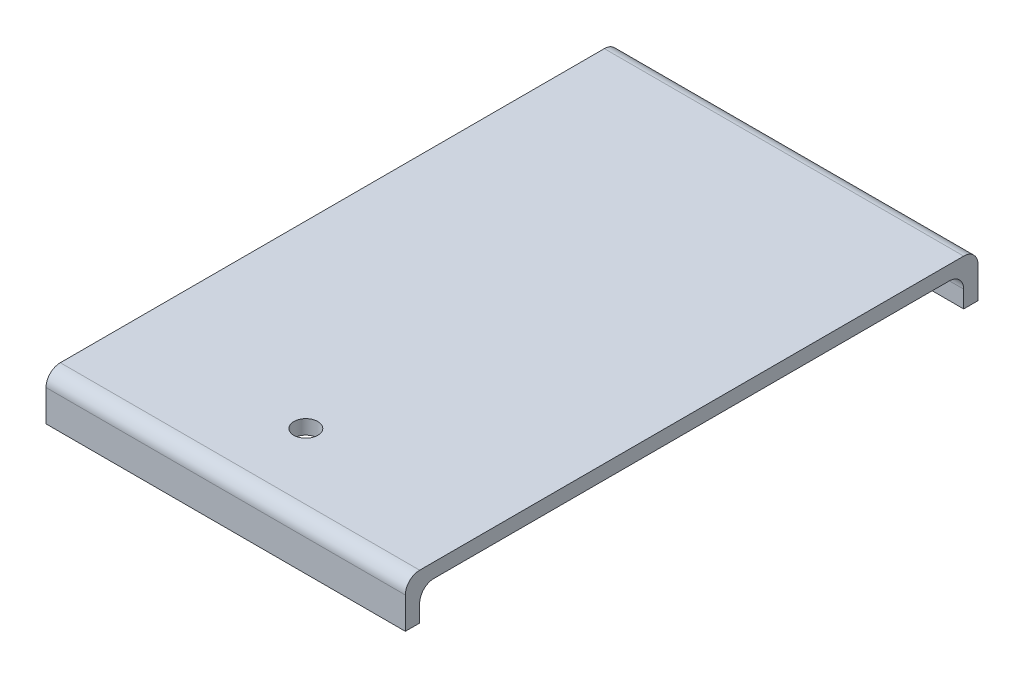
ISO-10303-21;
HEADER;
FILE_DESCRIPTION(('STEP AP214'),'2;1');
FILE_NAME('part.step','',(''),(''),'','','');
FILE_SCHEMA(('AUTOMOTIVE_DESIGN { 1 0 10303 214 1 1 1 1 }'));
ENDSEC;
DATA;
#1=APPLICATION_CONTEXT('core data for automotive mechanical design processes');
#2=APPLICATION_PROTOCOL_DEFINITION('international standard','automotive_design',2000,#1);
#3=PRODUCT_CONTEXT('',#1,'mechanical');
#4=PRODUCT('Part','Part','',(#3));
#5=PRODUCT_RELATED_PRODUCT_CATEGORY('part','',(#4));
#6=PRODUCT_DEFINITION_FORMATION('','',#4);
#7=PRODUCT_DEFINITION_CONTEXT('part definition',#1,'design');
#8=PRODUCT_DEFINITION('design','',#6,#7);
#9=PRODUCT_DEFINITION_SHAPE('','',#8);
#10=(LENGTH_UNIT() NAMED_UNIT(*) SI_UNIT(.MILLI.,.METRE.));
#11=(NAMED_UNIT(*) PLANE_ANGLE_UNIT() SI_UNIT($,.RADIAN.));
#12=(NAMED_UNIT(*) SI_UNIT($,.STERADIAN.) SOLID_ANGLE_UNIT());
#13=UNCERTAINTY_MEASURE_WITH_UNIT(LENGTH_MEASURE(1.E-05),#10,'distance_accuracy_value','');
#14=(GEOMETRIC_REPRESENTATION_CONTEXT(3) GLOBAL_UNCERTAINTY_ASSIGNED_CONTEXT((#13)) GLOBAL_UNIT_ASSIGNED_CONTEXT((#10,
#11,#12)) REPRESENTATION_CONTEXT('',''));
#15=CARTESIAN_POINT('',(0.,0.,0.));
#16=DIRECTION('',(0.,0.,1.));
#17=DIRECTION('',(1.,0.,0.));
#18=AXIS2_PLACEMENT_3D('',#15,#16,#17);
#19=CARTESIAN_POINT('',(0.,15.9999999999999,100.));
#20=DIRECTION('',(0.,0.,1.));
#21=DIRECTION('',(1.,0.,0.));
#22=AXIS2_PLACEMENT_3D('',#19,#20,#21);
#23=PLANE('',#22);
#24=DIRECTION('',(1.,0.,0.));
#25=VECTOR('',#24,1.);
#26=CARTESIAN_POINT('',(0.,0.,100.));
#27=LINE('',#26,#25);
#28=CARTESIAN_POINT('',(125.5,0.,100.));
#29=VERTEX_POINT('',#28);
#30=CARTESIAN_POINT('',(0.,0.,100.));
#31=VERTEX_POINT('',#30);
#32=EDGE_CURVE('E112',#29,#31,#27,.F.);
#33=ORIENTED_EDGE('',*,*,#32,.F.);
#34=DIRECTION('',(0.,1.,0.));
#35=VECTOR('',#34,1.);
#36=CARTESIAN_POINT('',(125.5,7.99999999999998,100.));
#37=LINE('',#36,#35);
#38=CARTESIAN_POINT('',(125.5,10.9999999999999,100.));
#39=VERTEX_POINT('',#38);
#40=EDGE_CURVE('E124',#39,#29,#37,.F.);
#41=ORIENTED_EDGE('',*,*,#40,.F.);
#42=DIRECTION('',(1.,0.,0.));
#43=VECTOR('',#42,1.);
#44=CARTESIAN_POINT('',(0.,10.9999999999999,100.));
#45=LINE('',#44,#43);
#46=CARTESIAN_POINT('',(0.,10.9999999999999,100.));
#47=VERTEX_POINT('',#46);
#48=EDGE_CURVE('E135',#47,#39,#45,.T.);
#49=ORIENTED_EDGE('',*,*,#48,.F.);
#50=DIRECTION('',(0.,1.,0.));
#51=VECTOR('',#50,1.);
#52=CARTESIAN_POINT('',(0.,7.99999999999998,100.));
#53=LINE('',#52,#51);
#54=EDGE_CURVE('E142',#47,#31,#53,.F.);
#55=ORIENTED_EDGE('',*,*,#54,.T.);
#56=EDGE_LOOP('',(#33,#41,#49,#55));
#57=FACE_BOUND('',#56,.T.);
#58=ADVANCED_FACE('F17',(#57),#23,.T.);
#59=CARTESIAN_POINT('',(0.,0.,100.));
#60=DIRECTION('',(0.,-1.,0.));
#61=DIRECTION('',(0.,0.,-1.));
#62=AXIS2_PLACEMENT_3D('',#59,#60,#61);
#63=PLANE('',#62);
#64=ORIENTED_EDGE('',*,*,#32,.T.);
#65=DIRECTION('',(0.,0.,-1.));
#66=VECTOR('',#65,1.);
#67=CARTESIAN_POINT('',(0.,0.,0.));
#68=LINE('',#67,#66);
#69=CARTESIAN_POINT('',(0.,0.,95.));
#70=VERTEX_POINT('',#69);
#71=EDGE_CURVE('E86',#31,#70,#68,.T.);
#72=ORIENTED_EDGE('',*,*,#71,.T.);
#73=DIRECTION('',(1.,0.,0.));
#74=VECTOR('',#73,1.);
#75=CARTESIAN_POINT('',(0.,0.,95.));
#76=LINE('',#75,#74);
#77=CARTESIAN_POINT('',(125.5,0.,95.));
#78=VERTEX_POINT('',#77);
#79=EDGE_CURVE('E107',#70,#78,#76,.T.);
#80=ORIENTED_EDGE('',*,*,#79,.T.);
#81=DIRECTION('',(0.,0.,-1.));
#82=VECTOR('',#81,1.);
#83=CARTESIAN_POINT('',(125.5,0.,0.));
#84=LINE('',#83,#82);
#85=EDGE_CURVE('E110',#29,#78,#84,.T.);
#86=ORIENTED_EDGE('',*,*,#85,.F.);
#87=EDGE_LOOP('',(#64,#72,#80,#86));
#88=FACE_BOUND('',#87,.T.);
#89=ADVANCED_FACE('F108',(#88),#63,.T.);
#90=CARTESIAN_POINT('',(0.,11.,95.));
#91=DIRECTION('',(0.,0.,1.));
#92=DIRECTION('',(1.,0.,0.));
#93=AXIS2_PLACEMENT_3D('',#90,#91,#92);
#94=PLANE('',#93);
#95=DIRECTION('',(0.,1.,0.));
#96=VECTOR('',#95,1.);
#97=CARTESIAN_POINT('',(125.5,7.99999999999998,95.));
#98=LINE('',#97,#96);
#99=CARTESIAN_POINT('',(125.5,5.99999999999999,95.));
#100=VERTEX_POINT('',#99);
#101=EDGE_CURVE('E115',#78,#100,#98,.T.);
#102=ORIENTED_EDGE('',*,*,#101,.F.);
#103=ORIENTED_EDGE('',*,*,#79,.F.);
#104=DIRECTION('',(0.,1.,0.));
#105=VECTOR('',#104,1.);
#106=CARTESIAN_POINT('',(0.,7.99999999999998,95.));
#107=LINE('',#106,#105);
#108=CARTESIAN_POINT('',(0.,5.99999999999999,95.));
#109=VERTEX_POINT('',#108);
#110=EDGE_CURVE('E76',#70,#109,#107,.T.);
#111=ORIENTED_EDGE('',*,*,#110,.T.);
#112=DIRECTION('',(1.,0.,0.));
#113=VECTOR('',#112,1.);
#114=CARTESIAN_POINT('',(0.,5.99999999999999,95.));
#115=LINE('',#114,#113);
#116=EDGE_CURVE('E103',#109,#100,#115,.T.);
#117=ORIENTED_EDGE('',*,*,#116,.T.);
#118=EDGE_LOOP('',(#102,#103,#111,#117));
#119=FACE_BOUND('',#118,.T.);
#120=ADVANCED_FACE('F116',(#119),#94,.F.);
#121=CARTESIAN_POINT('',(0.,5.99999999999999,90.));
#122=DIRECTION('',(1.,0.,0.));
#123=DIRECTION('',(0.,0.,-1.));
#124=AXIS2_PLACEMENT_3D('',#121,#122,#123);
#125=CYLINDRICAL_SURFACE('',#124,5.);
#126=DIRECTION('',(1.,0.,0.));
#127=VECTOR('',#126,1.);
#128=CARTESIAN_POINT('',(0.,11.,90.));
#129=LINE('',#128,#127);
#130=CARTESIAN_POINT('',(0.,11.,90.));
#131=VERTEX_POINT('',#130);
#132=CARTESIAN_POINT('',(125.5,11.,90.));
#133=VERTEX_POINT('',#132);
#134=EDGE_CURVE('E143',#131,#133,#129,.T.);
#135=ORIENTED_EDGE('',*,*,#134,.T.);
#136=CARTESIAN_POINT('',(125.5,5.99999999999999,90.));
#137=DIRECTION('',(1.,0.,0.));
#138=DIRECTION('',(0.,0.,-1.));
#139=AXIS2_PLACEMENT_3D('',#136,#137,#138);
#140=CIRCLE('',#139,5.);
#141=EDGE_CURVE('E119',#100,#133,#140,.F.);
#142=ORIENTED_EDGE('',*,*,#141,.F.);
#143=ORIENTED_EDGE('',*,*,#116,.F.);
#144=CARTESIAN_POINT('',(0.,5.99999999999999,90.));
#145=DIRECTION('',(1.,0.,0.));
#146=DIRECTION('',(0.,0.,-1.));
#147=AXIS2_PLACEMENT_3D('',#144,#145,#146);
#148=CIRCLE('',#147,5.);
#149=EDGE_CURVE('E20',#109,#131,#148,.F.);
#150=ORIENTED_EDGE('',*,*,#149,.T.);
#151=EDGE_LOOP('',(#135,#142,#143,#150));
#152=FACE_BOUND('',#151,.T.);
#153=ADVANCED_FACE('F218',(#152),#125,.F.);
#154=CARTESIAN_POINT('',(0.,6.00000000000001,-90.));
#155=DIRECTION('',(1.,0.,0.));
#156=DIRECTION('',(0.,0.,-1.));
#157=AXIS2_PLACEMENT_3D('',#154,#155,#156);
#158=CYLINDRICAL_SURFACE('',#157,5.);
#159=DIRECTION('',(-1.,0.,0.));
#160=VECTOR('',#159,1.);
#161=CARTESIAN_POINT('',(0.,6.00000000000001,-95.));
#162=LINE('',#161,#160);
#163=CARTESIAN_POINT('',(0.,6.00000000000001,-95.));
#164=VERTEX_POINT('',#163);
#165=CARTESIAN_POINT('',(125.5,6.00000000000001,-95.));
#166=VERTEX_POINT('',#165);
#167=EDGE_CURVE('E205',#164,#166,#162,.F.);
#168=ORIENTED_EDGE('',*,*,#167,.T.);
#169=CARTESIAN_POINT('',(125.5,6.00000000000001,-90.));
#170=DIRECTION('',(1.,0.,0.));
#171=DIRECTION('',(0.,0.,-1.));
#172=AXIS2_PLACEMENT_3D('',#169,#170,#171);
#173=CIRCLE('',#172,5.);
#174=CARTESIAN_POINT('',(125.5,11.,-90.));
#175=VERTEX_POINT('',#174);
#176=EDGE_CURVE('E159',#175,#166,#173,.F.);
#177=ORIENTED_EDGE('',*,*,#176,.F.);
#178=DIRECTION('',(1.,0.,0.));
#179=VECTOR('',#178,1.);
#180=CARTESIAN_POINT('',(0.,11.,-90.));
#181=LINE('',#180,#179);
#182=CARTESIAN_POINT('',(0.,11.,-90.));
#183=VERTEX_POINT('',#182);
#184=EDGE_CURVE('E195',#175,#183,#181,.F.);
#185=ORIENTED_EDGE('',*,*,#184,.T.);
#186=CARTESIAN_POINT('',(0.,6.00000000000001,-90.));
#187=DIRECTION('',(1.,0.,0.));
#188=DIRECTION('',(0.,0.,-1.));
#189=AXIS2_PLACEMENT_3D('',#186,#187,#188);
#190=CIRCLE('',#189,5.);
#191=EDGE_CURVE('E171',#183,#164,#190,.F.);
#192=ORIENTED_EDGE('',*,*,#191,.T.);
#193=EDGE_LOOP('',(#168,#177,#185,#192));
#194=FACE_BOUND('',#193,.T.);
#195=ADVANCED_FACE('F212',(#194),#158,.F.);
#196=CARTESIAN_POINT('',(0.,0.,-95.));
#197=DIRECTION('',(0.,0.,-1.));
#198=DIRECTION('',(-1.,0.,0.));
#199=AXIS2_PLACEMENT_3D('',#196,#197,#198);
#200=PLANE('',#199);
#201=DIRECTION('',(0.,1.,0.));
#202=VECTOR('',#201,1.);
#203=CARTESIAN_POINT('',(0.,7.99999999999998,-95.));
#204=LINE('',#203,#202);
#205=CARTESIAN_POINT('',(0.,0.,-95.));
#206=VERTEX_POINT('',#205);
#207=EDGE_CURVE('E148',#164,#206,#204,.F.);
#208=ORIENTED_EDGE('',*,*,#207,.T.);
#209=DIRECTION('',(1.,0.,0.));
#210=VECTOR('',#209,1.);
#211=CARTESIAN_POINT('',(0.,0.,-95.));
#212=LINE('',#211,#210);
#213=CARTESIAN_POINT('',(125.5,0.,-95.));
#214=VERTEX_POINT('',#213);
#215=EDGE_CURVE('E196',#214,#206,#212,.F.);
#216=ORIENTED_EDGE('',*,*,#215,.F.);
#217=DIRECTION('',(0.,1.,0.));
#218=VECTOR('',#217,1.);
#219=CARTESIAN_POINT('',(125.5,7.99999999999998,-95.));
#220=LINE('',#219,#218);
#221=EDGE_CURVE('E162',#166,#214,#220,.F.);
#222=ORIENTED_EDGE('',*,*,#221,.F.);
#223=ORIENTED_EDGE('',*,*,#167,.F.);
#224=EDGE_LOOP('',(#208,#216,#222,#223));
#225=FACE_BOUND('',#224,.T.);
#226=ADVANCED_FACE('F227',(#225),#200,.F.);
#227=CARTESIAN_POINT('',(0.,0.,100.));
#228=DIRECTION('',(0.,-1.,0.));
#229=DIRECTION('',(0.,0.,-1.));
#230=AXIS2_PLACEMENT_3D('',#227,#228,#229);
#231=PLANE('',#230);
#232=DIRECTION('',(-1.,0.,0.));
#233=VECTOR('',#232,1.);
#234=CARTESIAN_POINT('',(0.,0.,-100.));
#235=LINE('',#234,#233);
#236=CARTESIAN_POINT('',(125.5,0.,-100.));
#237=VERTEX_POINT('',#236);
#238=CARTESIAN_POINT('',(0.,0.,-100.));
#239=VERTEX_POINT('',#238);
#240=EDGE_CURVE('E192',#237,#239,#235,.T.);
#241=ORIENTED_EDGE('',*,*,#240,.F.);
#242=DIRECTION('',(0.,0.,-1.));
#243=VECTOR('',#242,1.);
#244=CARTESIAN_POINT('',(125.5,0.,0.));
#245=LINE('',#244,#243);
#246=EDGE_CURVE('E199',#214,#237,#245,.T.);
#247=ORIENTED_EDGE('',*,*,#246,.F.);
#248=ORIENTED_EDGE('',*,*,#215,.T.);
#249=DIRECTION('',(0.,0.,-1.));
#250=VECTOR('',#249,1.);
#251=CARTESIAN_POINT('',(0.,0.,0.));
#252=LINE('',#251,#250);
#253=EDGE_CURVE('E144',#206,#239,#252,.T.);
#254=ORIENTED_EDGE('',*,*,#253,.T.);
#255=EDGE_LOOP('',(#241,#247,#248,#254));
#256=FACE_BOUND('',#255,.T.);
#257=ADVANCED_FACE('F233',(#256),#231,.T.);
#258=CARTESIAN_POINT('',(0.,0.,-100.));
#259=DIRECTION('',(0.,0.,-1.));
#260=DIRECTION('',(-1.,0.,0.));
#261=AXIS2_PLACEMENT_3D('',#258,#259,#260);
#262=PLANE('',#261);
#263=ORIENTED_EDGE('',*,*,#240,.T.);
#264=DIRECTION('',(0.,1.,0.));
#265=VECTOR('',#264,1.);
#266=CARTESIAN_POINT('',(0.,7.99999999999998,-100.));
#267=LINE('',#266,#265);
#268=CARTESIAN_POINT('',(0.,11.,-100.));
#269=VERTEX_POINT('',#268);
#270=EDGE_CURVE('E147',#239,#269,#267,.T.);
#271=ORIENTED_EDGE('',*,*,#270,.T.);
#272=DIRECTION('',(1.,0.,0.));
#273=VECTOR('',#272,1.);
#274=CARTESIAN_POINT('',(0.,11.,-100.));
#275=LINE('',#274,#273);
#276=CARTESIAN_POINT('',(125.5,11.,-100.));
#277=VERTEX_POINT('',#276);
#278=EDGE_CURVE('E139',#277,#269,#275,.F.);
#279=ORIENTED_EDGE('',*,*,#278,.F.);
#280=DIRECTION('',(0.,1.,0.));
#281=VECTOR('',#280,1.);
#282=CARTESIAN_POINT('',(125.5,7.99999999999998,-100.));
#283=LINE('',#282,#281);
#284=EDGE_CURVE('E158',#237,#277,#283,.T.);
#285=ORIENTED_EDGE('',*,*,#284,.F.);
#286=EDGE_LOOP('',(#263,#271,#279,#285));
#287=FACE_BOUND('',#286,.T.);
#288=ADVANCED_FACE('F261',(#287),#262,.T.);
#289=CARTESIAN_POINT('',(0.,11.,-95.));
#290=DIRECTION('',(0.,1.,0.));
#291=DIRECTION('',(0.,0.,1.));
#292=AXIS2_PLACEMENT_3D('',#289,#290,#291);
#293=PLANE('',#292);
#294=CARTESIAN_POINT('',(62.75,10.9999999999999,72.));
#295=DIRECTION('',(0.,1.,0.));
#296=DIRECTION('',(0.,0.,1.));
#297=AXIS2_PLACEMENT_3D('',#294,#295,#296);
#298=CIRCLE('',#297,4.188);
#299=CARTESIAN_POINT('',(62.75,10.9999999999999,76.188));
#300=VERTEX_POINT('',#299);
#301=EDGE_CURVE('E154',#300,#300,#298,.T.);
#302=ORIENTED_EDGE('',*,*,#301,.T.);
#303=EDGE_LOOP('',(#302));
#304=FACE_BOUND('',#303,.T.);
#305=DIRECTION('',(0.,0.,-1.));
#306=VECTOR('',#305,1.);
#307=CARTESIAN_POINT('',(0.,11.,0.));
#308=LINE('',#307,#306);
#309=EDGE_CURVE('E172',#131,#183,#308,.T.);
#310=ORIENTED_EDGE('',*,*,#309,.T.);
#311=ORIENTED_EDGE('',*,*,#184,.F.);
#312=DIRECTION('',(0.,0.,-1.));
#313=VECTOR('',#312,1.);
#314=CARTESIAN_POINT('',(125.5,11.,0.));
#315=LINE('',#314,#313);
#316=EDGE_CURVE('E163',#133,#175,#315,.T.);
#317=ORIENTED_EDGE('',*,*,#316,.F.);
#318=ORIENTED_EDGE('',*,*,#134,.F.);
#319=EDGE_LOOP('',(#310,#311,#317,#318));
#320=FACE_BOUND('',#319,.T.);
#321=ADVANCED_FACE('F215',(#304,#320),#293,.F.);
#322=CARTESIAN_POINT('',(0.,11.,-95.));
#323=DIRECTION('',(1.,0.,0.));
#324=DIRECTION('',(0.,0.,-1.));
#325=AXIS2_PLACEMENT_3D('',#322,#323,#324);
#326=CYLINDRICAL_SURFACE('',#325,5.);
#327=CARTESIAN_POINT('',(0.,11.,-95.));
#328=DIRECTION('',(1.,0.,0.));
#329=DIRECTION('',(0.,0.,-1.));
#330=AXIS2_PLACEMENT_3D('',#327,#328,#329);
#331=CIRCLE('',#330,5.);
#332=CARTESIAN_POINT('',(0.,16.,-95.));
#333=VERTEX_POINT('',#332);
#334=EDGE_CURVE('E170',#269,#333,#331,.T.);
#335=ORIENTED_EDGE('',*,*,#334,.T.);
#336=DIRECTION('',(1.,0.,0.));
#337=VECTOR('',#336,1.);
#338=CARTESIAN_POINT('',(0.,16.,-95.));
#339=LINE('',#338,#337);
#340=CARTESIAN_POINT('',(125.5,16.,-95.));
#341=VERTEX_POINT('',#340);
#342=EDGE_CURVE('E157',#341,#333,#339,.F.);
#343=ORIENTED_EDGE('',*,*,#342,.F.);
#344=CARTESIAN_POINT('',(125.5,11.,-95.));
#345=DIRECTION('',(1.,0.,0.));
#346=DIRECTION('',(0.,0.,-1.));
#347=AXIS2_PLACEMENT_3D('',#344,#345,#346);
#348=CIRCLE('',#347,5.);
#349=EDGE_CURVE('E137',#277,#341,#348,.T.);
#350=ORIENTED_EDGE('',*,*,#349,.F.);
#351=ORIENTED_EDGE('',*,*,#278,.T.);
#352=EDGE_LOOP('',(#335,#343,#350,#351));
#353=FACE_BOUND('',#352,.T.);
#354=ADVANCED_FACE('F265',(#353),#326,.T.);
#355=CARTESIAN_POINT('',(0.,7.99999999999998,0.));
#356=DIRECTION('',(1.,0.,0.));
#357=DIRECTION('',(0.,0.,-1.));
#358=AXIS2_PLACEMENT_3D('',#355,#356,#357);
#359=PLANE('',#358);
#360=ORIENTED_EDGE('',*,*,#270,.F.);
#361=ORIENTED_EDGE('',*,*,#253,.F.);
#362=ORIENTED_EDGE('',*,*,#207,.F.);
#363=ORIENTED_EDGE('',*,*,#191,.F.);
#364=ORIENTED_EDGE('',*,*,#309,.F.);
#365=ORIENTED_EDGE('',*,*,#149,.F.);
#366=ORIENTED_EDGE('',*,*,#110,.F.);
#367=ORIENTED_EDGE('',*,*,#71,.F.);
#368=ORIENTED_EDGE('',*,*,#54,.F.);
#369=CARTESIAN_POINT('',(0.,10.9999999999999,95.));
#370=DIRECTION('',(1.,0.,0.));
#371=DIRECTION('',(0.,0.,-1.));
#372=AXIS2_PLACEMENT_3D('',#369,#370,#371);
#373=CIRCLE('',#372,5.);
#374=CARTESIAN_POINT('',(0.,15.9999999999999,95.));
#375=VERTEX_POINT('',#374);
#376=EDGE_CURVE('E138',#375,#47,#373,.T.);
#377=ORIENTED_EDGE('',*,*,#376,.F.);
#378=DIRECTION('',(0.,0.,1.));
#379=VECTOR('',#378,1.);
#380=CARTESIAN_POINT('',(0.,16.,-100.));
#381=LINE('',#380,#379);
#382=EDGE_CURVE('E251',#333,#375,#381,.T.);
#383=ORIENTED_EDGE('',*,*,#382,.F.);
#384=ORIENTED_EDGE('',*,*,#334,.F.);
#385=EDGE_LOOP('',(#360,#361,#362,#363,#364,#365,#366,#367,#368,#377,#383,#384));
#386=FACE_BOUND('',#385,.T.);
#387=ADVANCED_FACE('F222',(#386),#359,.F.);
#388=CARTESIAN_POINT('',(0.,10.9999999999999,95.));
#389=DIRECTION('',(1.,0.,0.));
#390=DIRECTION('',(0.,0.,-1.));
#391=AXIS2_PLACEMENT_3D('',#388,#389,#390);
#392=CYLINDRICAL_SURFACE('',#391,5.);
#393=ORIENTED_EDGE('',*,*,#376,.T.);
#394=ORIENTED_EDGE('',*,*,#48,.T.);
#395=CARTESIAN_POINT('',(125.5,10.9999999999999,95.));
#396=DIRECTION('',(1.,0.,0.));
#397=DIRECTION('',(0.,0.,-1.));
#398=AXIS2_PLACEMENT_3D('',#395,#396,#397);
#399=CIRCLE('',#398,5.);
#400=CARTESIAN_POINT('',(125.5,15.9999999999999,95.));
#401=VERTEX_POINT('',#400);
#402=EDGE_CURVE('E35',#401,#39,#399,.T.);
#403=ORIENTED_EDGE('',*,*,#402,.F.);
#404=DIRECTION('',(1.,0.,0.));
#405=VECTOR('',#404,1.);
#406=CARTESIAN_POINT('',(0.,15.9999999999999,95.));
#407=LINE('',#406,#405);
#408=EDGE_CURVE('E248',#375,#401,#407,.T.);
#409=ORIENTED_EDGE('',*,*,#408,.F.);
#410=EDGE_LOOP('',(#393,#394,#403,#409));
#411=FACE_BOUND('',#410,.T.);
#412=ADVANCED_FACE('F271',(#411),#392,.T.);
#413=CARTESIAN_POINT('',(125.5,7.99999999999998,0.));
#414=DIRECTION('',(1.,0.,0.));
#415=DIRECTION('',(0.,0.,-1.));
#416=AXIS2_PLACEMENT_3D('',#413,#414,#415);
#417=PLANE('',#416);
#418=ORIENTED_EDGE('',*,*,#246,.T.);
#419=ORIENTED_EDGE('',*,*,#284,.T.);
#420=ORIENTED_EDGE('',*,*,#349,.T.);
#421=DIRECTION('',(0.,0.,1.));
#422=VECTOR('',#421,1.);
#423=CARTESIAN_POINT('',(125.5,16.,-100.));
#424=LINE('',#423,#422);
#425=EDGE_CURVE('E26',#401,#341,#424,.F.);
#426=ORIENTED_EDGE('',*,*,#425,.F.);
#427=ORIENTED_EDGE('',*,*,#402,.T.);
#428=ORIENTED_EDGE('',*,*,#40,.T.);
#429=ORIENTED_EDGE('',*,*,#85,.T.);
#430=ORIENTED_EDGE('',*,*,#101,.T.);
#431=ORIENTED_EDGE('',*,*,#141,.T.);
#432=ORIENTED_EDGE('',*,*,#316,.T.);
#433=ORIENTED_EDGE('',*,*,#176,.T.);
#434=ORIENTED_EDGE('',*,*,#221,.T.);
#435=EDGE_LOOP('',(#418,#419,#420,#426,#427,#428,#429,#430,#431,#432,#433,#434));
#436=FACE_BOUND('',#435,.T.);
#437=ADVANCED_FACE('F122',(#436),#417,.T.);
#438=CARTESIAN_POINT('',(62.75,-220.656396490777,71.9999999999999));
#439=DIRECTION('',(0.,1.,0.));
#440=DIRECTION('',(0.,0.,1.));
#441=AXIS2_PLACEMENT_3D('',#438,#439,#440);
#442=CYLINDRICAL_SURFACE('',#441,4.188);
#443=CARTESIAN_POINT('',(62.75,15.9999999999999,72.));
#444=DIRECTION('',(0.,1.,0.));
#445=DIRECTION('',(0.,0.,1.));
#446=AXIS2_PLACEMENT_3D('',#443,#444,#445);
#447=CIRCLE('',#446,4.188);
#448=CARTESIAN_POINT('',(62.75,15.9999999999999,76.188));
#449=VERTEX_POINT('',#448);
#450=EDGE_CURVE('E11',#449,#449,#447,.F.);
#451=ORIENTED_EDGE('',*,*,#450,.F.);
#452=EDGE_LOOP('',(#451));
#453=FACE_BOUND('',#452,.T.);
#454=ORIENTED_EDGE('',*,*,#301,.F.);
#455=EDGE_LOOP('',(#454));
#456=FACE_BOUND('',#455,.T.);
#457=ADVANCED_FACE('F280',(#453,#456),#442,.F.);
#458=CARTESIAN_POINT('',(0.,16.,-100.));
#459=DIRECTION('',(0.,1.,0.));
#460=DIRECTION('',(0.,0.,1.));
#461=AXIS2_PLACEMENT_3D('',#458,#459,#460);
#462=PLANE('',#461);
#463=ORIENTED_EDGE('',*,*,#450,.T.);
#464=EDGE_LOOP('',(#463));
#465=FACE_BOUND('',#464,.T.);
#466=ORIENTED_EDGE('',*,*,#408,.T.);
#467=ORIENTED_EDGE('',*,*,#425,.T.);
#468=ORIENTED_EDGE('',*,*,#342,.T.);
#469=ORIENTED_EDGE('',*,*,#382,.T.);
#470=EDGE_LOOP('',(#466,#467,#468,#469));
#471=FACE_BOUND('',#470,.T.);
#472=ADVANCED_FACE('F268',(#465,#471),#462,.T.);
#473=CLOSED_SHELL('',(#58,#89,#120,#153,#195,#226,#257,#288,#321,#354,#387,#412,#437,#457,#472));
#474=MANIFOLD_SOLID_BREP('B1',#473);
#475=ADVANCED_BREP_SHAPE_REPRESENTATION('',(#18,#474),#14);
#476=SHAPE_DEFINITION_REPRESENTATION(#9,#475);
ENDSEC;
END-ISO-10303-21;
